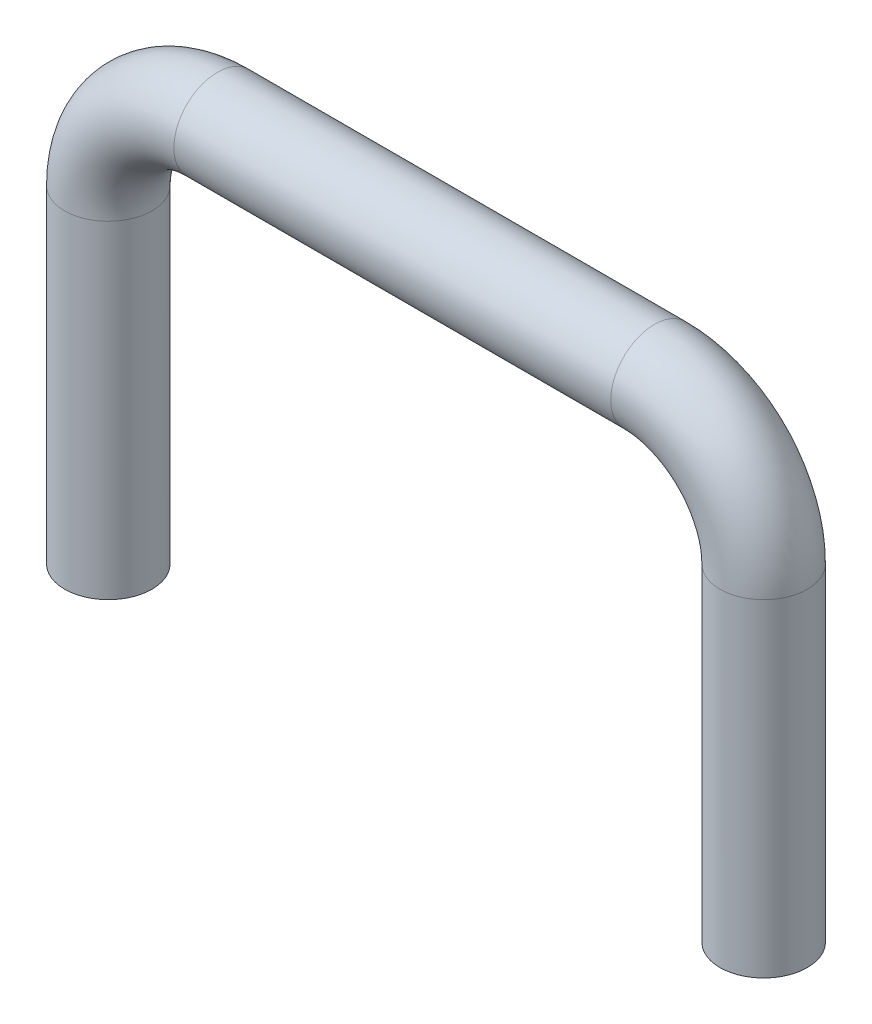
ISO-10303-21;
HEADER;
FILE_DESCRIPTION(('STEP AP214'),'2;1');
FILE_NAME('part.step','',(''),(''),'','','');
FILE_SCHEMA(('AUTOMOTIVE_DESIGN { 1 0 10303 214 1 1 1 1 }'));
ENDSEC;
DATA;
#1=APPLICATION_CONTEXT('core data for automotive mechanical design processes');
#2=APPLICATION_PROTOCOL_DEFINITION('international standard','automotive_design',2000,#1);
#3=PRODUCT_CONTEXT('',#1,'mechanical');
#4=PRODUCT('Part','Part','',(#3));
#5=PRODUCT_RELATED_PRODUCT_CATEGORY('part','',(#4));
#6=PRODUCT_DEFINITION_FORMATION('','',#4);
#7=PRODUCT_DEFINITION_CONTEXT('part definition',#1,'design');
#8=PRODUCT_DEFINITION('design','',#6,#7);
#9=PRODUCT_DEFINITION_SHAPE('','',#8);
#10=(LENGTH_UNIT() NAMED_UNIT(*) SI_UNIT(.MILLI.,.METRE.));
#11=(NAMED_UNIT(*) PLANE_ANGLE_UNIT() SI_UNIT($,.RADIAN.));
#12=(NAMED_UNIT(*) SI_UNIT($,.STERADIAN.) SOLID_ANGLE_UNIT());
#13=UNCERTAINTY_MEASURE_WITH_UNIT(LENGTH_MEASURE(1.E-05),#10,'distance_accuracy_value','');
#14=(GEOMETRIC_REPRESENTATION_CONTEXT(3) GLOBAL_UNCERTAINTY_ASSIGNED_CONTEXT((#13)) GLOBAL_UNIT_ASSIGNED_CONTEXT((#10,
#11,#12)) REPRESENTATION_CONTEXT('',''));
#15=CARTESIAN_POINT('',(0.,0.,0.));
#16=DIRECTION('',(0.,0.,1.));
#17=DIRECTION('',(1.,0.,0.));
#18=AXIS2_PLACEMENT_3D('',#15,#16,#17);
#19=CARTESIAN_POINT('',(-15.,0.,0.));
#20=DIRECTION('',(0.,1.,0.));
#21=DIRECTION('',(0.,0.,1.));
#22=AXIS2_PLACEMENT_3D('',#19,#20,#21);
#23=PLANE('',#22);
#24=CARTESIAN_POINT('',(-15.,0.,0.));
#25=DIRECTION('',(0.,1.,0.));
#26=DIRECTION('',(0.,0.,1.));
#27=AXIS2_PLACEMENT_3D('',#24,#25,#26);
#28=CIRCLE('',#27,2.);
#29=CARTESIAN_POINT('',(-15.,0.,2.));
#30=VERTEX_POINT('',#29);
#31=EDGE_CURVE('E68',#30,#30,#28,.T.);
#32=ORIENTED_EDGE('',*,*,#31,.F.);
#33=EDGE_LOOP('',(#32));
#34=FACE_BOUND('',#33,.T.);
#35=ADVANCED_FACE('F41',(#34),#23,.F.);
#36=CARTESIAN_POINT('',(15.,0.,0.));
#37=DIRECTION('',(0.,-1.,0.));
#38=DIRECTION('',(0.,0.,1.));
#39=AXIS2_PLACEMENT_3D('',#36,#37,#38);
#40=PLANE('',#39);
#41=CARTESIAN_POINT('',(15.,0.,0.));
#42=DIRECTION('',(0.,-1.,0.));
#43=DIRECTION('',(0.,0.,1.));
#44=AXIS2_PLACEMENT_3D('',#41,#42,#43);
#45=CIRCLE('',#44,2.);
#46=CARTESIAN_POINT('',(15.,0.,2.));
#47=VERTEX_POINT('',#46);
#48=EDGE_CURVE('E10',#47,#47,#45,.T.);
#49=ORIENTED_EDGE('',*,*,#48,.T.);
#50=EDGE_LOOP('',(#49));
#51=FACE_BOUND('',#50,.T.);
#52=ADVANCED_FACE('F76',(#51),#40,.T.);
#53=CARTESIAN_POINT('',(-15.,0.,0.));
#54=DIRECTION('',(0.,1.,0.));
#55=DIRECTION('',(0.,0.,1.));
#56=AXIS2_PLACEMENT_3D('',#53,#54,#55);
#57=CYLINDRICAL_SURFACE('',#56,2.);
#58=CARTESIAN_POINT('',(-15.,15.,0.));
#59=DIRECTION('',(0.,1.,0.));
#60=DIRECTION('',(0.,0.,1.));
#61=AXIS2_PLACEMENT_3D('',#58,#59,#60);
#62=CIRCLE('',#61,2.);
#63=CARTESIAN_POINT('',(-17.,15.,0.));
#64=VERTEX_POINT('',#63);
#65=EDGE_CURVE('E64',#64,#64,#62,.T.);
#66=ORIENTED_EDGE('',*,*,#65,.F.);
#67=EDGE_LOOP('',(#66));
#68=FACE_BOUND('',#67,.T.);
#69=ORIENTED_EDGE('',*,*,#31,.T.);
#70=EDGE_LOOP('',(#69));
#71=FACE_BOUND('',#70,.T.);
#72=ADVANCED_FACE('F73',(#68,#71),#57,.T.);
#73=CARTESIAN_POINT('',(-10.,15.,0.));
#74=DIRECTION('',(0.,0.,-1.));
#75=DIRECTION('',(-1.,0.,0.));
#76=AXIS2_PLACEMENT_3D('',#73,#74,#75);
#77=TOROIDAL_SURFACE('',#76,5.,2.);
#78=CARTESIAN_POINT('',(-10.,20.,0.));
#79=DIRECTION('',(1.,0.,0.));
#80=DIRECTION('',(0.,0.,1.));
#81=AXIS2_PLACEMENT_3D('',#78,#79,#80);
#82=CIRCLE('',#81,2.);
#83=CARTESIAN_POINT('',(-10.,22.,0.));
#84=VERTEX_POINT('',#83);
#85=EDGE_CURVE('E58',#84,#84,#82,.T.);
#86=CARTESIAN_POINT('',(-10.,15.,0.));
#87=DIRECTION('',(0.,0.,-1.));
#88=DIRECTION('',(-1.,0.,0.));
#89=AXIS2_PLACEMENT_3D('',#86,#87,#88);
#90=CIRCLE('',#89,7.);
#91=EDGE_CURVE('',#64,#84,#90,.T.);
#92=ORIENTED_EDGE('',*,*,#65,.T.);
#93=ORIENTED_EDGE('',*,*,#85,.F.);
#94=ORIENTED_EDGE('',*,*,#91,.T.);
#95=ORIENTED_EDGE('',*,*,#91,.F.);
#96=EDGE_LOOP('',(#92,#94,#93,#95));
#97=FACE_BOUND('',#96,.T.);
#98=ADVANCED_FACE('F94',(#97),#77,.T.);
#99=CARTESIAN_POINT('',(-10.,20.,0.));
#100=DIRECTION('',(1.,0.,0.));
#101=DIRECTION('',(0.,1.,0.));
#102=AXIS2_PLACEMENT_3D('',#99,#100,#101);
#103=CYLINDRICAL_SURFACE('',#102,2.);
#104=CARTESIAN_POINT('',(10.,20.,0.));
#105=DIRECTION('',(1.,0.,0.));
#106=DIRECTION('',(0.,0.,1.));
#107=AXIS2_PLACEMENT_3D('',#104,#105,#106);
#108=CIRCLE('',#107,2.);
#109=CARTESIAN_POINT('',(10.,22.,0.));
#110=VERTEX_POINT('',#109);
#111=EDGE_CURVE('E53',#110,#110,#108,.T.);
#112=ORIENTED_EDGE('',*,*,#111,.F.);
#113=EDGE_LOOP('',(#112));
#114=FACE_BOUND('',#113,.T.);
#115=ORIENTED_EDGE('',*,*,#85,.T.);
#116=EDGE_LOOP('',(#115));
#117=FACE_BOUND('',#116,.T.);
#118=ADVANCED_FACE('F88',(#114,#117),#103,.T.);
#119=CARTESIAN_POINT('',(10.,15.,0.));
#120=DIRECTION('',(0.,0.,-1.));
#121=DIRECTION('',(-1.,0.,0.));
#122=AXIS2_PLACEMENT_3D('',#119,#120,#121);
#123=TOROIDAL_SURFACE('',#122,5.,2.);
#124=CARTESIAN_POINT('',(15.,15.,0.));
#125=DIRECTION('',(0.,-1.,0.));
#126=DIRECTION('',(0.,0.,1.));
#127=AXIS2_PLACEMENT_3D('',#124,#125,#126);
#128=CIRCLE('',#127,2.);
#129=CARTESIAN_POINT('',(17.,15.,0.));
#130=VERTEX_POINT('',#129);
#131=EDGE_CURVE('E48',#130,#130,#128,.T.);
#132=CARTESIAN_POINT('',(10.,15.,0.));
#133=DIRECTION('',(0.,0.,-1.));
#134=DIRECTION('',(-1.,0.,0.));
#135=AXIS2_PLACEMENT_3D('',#132,#133,#134);
#136=CIRCLE('',#135,7.);
#137=EDGE_CURVE('',#110,#130,#136,.T.);
#138=ORIENTED_EDGE('',*,*,#111,.T.);
#139=ORIENTED_EDGE('',*,*,#131,.F.);
#140=ORIENTED_EDGE('',*,*,#137,.T.);
#141=ORIENTED_EDGE('',*,*,#137,.F.);
#142=EDGE_LOOP('',(#138,#140,#139,#141));
#143=FACE_BOUND('',#142,.T.);
#144=ADVANCED_FACE('F82',(#143),#123,.T.);
#145=CARTESIAN_POINT('',(15.,15.,0.));
#146=DIRECTION('',(0.,-1.,0.));
#147=DIRECTION('',(1.,0.,0.));
#148=AXIS2_PLACEMENT_3D('',#145,#146,#147);
#149=CYLINDRICAL_SURFACE('',#148,2.);
#150=ORIENTED_EDGE('',*,*,#48,.F.);
#151=EDGE_LOOP('',(#150));
#152=FACE_BOUND('',#151,.T.);
#153=ORIENTED_EDGE('',*,*,#131,.T.);
#154=EDGE_LOOP('',(#153));
#155=FACE_BOUND('',#154,.T.);
#156=ADVANCED_FACE('F80',(#152,#155),#149,.T.);
#157=CLOSED_SHELL('',(#35,#52,#72,#98,#118,#144,#156));
#158=MANIFOLD_SOLID_BREP('B2',#157);
#159=ADVANCED_BREP_SHAPE_REPRESENTATION('',(#18,#158),#14);
#160=SHAPE_DEFINITION_REPRESENTATION(#9,#159);
ENDSEC;
END-ISO-10303-21;
